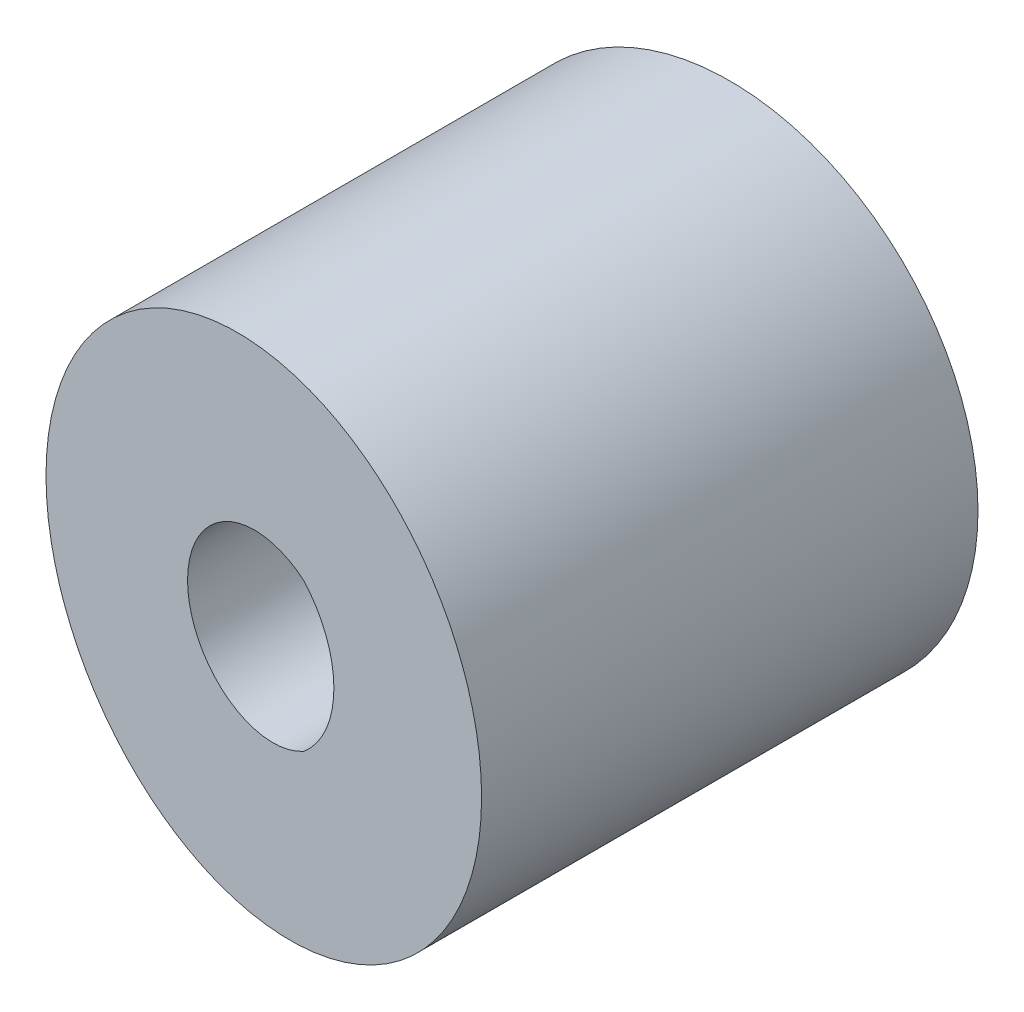
ISO-10303-21;
HEADER;
FILE_DESCRIPTION(('STEP AP214'),'2;1');
FILE_NAME('part.step','',(''),(''),'','','');
FILE_SCHEMA(('AUTOMOTIVE_DESIGN { 1 0 10303 214 1 1 1 1 }'));
ENDSEC;
DATA;
#1=APPLICATION_CONTEXT('core data for automotive mechanical design processes');
#2=APPLICATION_PROTOCOL_DEFINITION('international standard','automotive_design',2000,#1);
#3=PRODUCT_CONTEXT('',#1,'mechanical');
#4=PRODUCT('Part','Part','',(#3));
#5=PRODUCT_RELATED_PRODUCT_CATEGORY('part','',(#4));
#6=PRODUCT_DEFINITION_FORMATION('','',#4);
#7=PRODUCT_DEFINITION_CONTEXT('part definition',#1,'design');
#8=PRODUCT_DEFINITION('design','',#6,#7);
#9=PRODUCT_DEFINITION_SHAPE('','',#8);
#10=(LENGTH_UNIT() NAMED_UNIT(*) SI_UNIT(.MILLI.,.METRE.));
#11=(NAMED_UNIT(*) PLANE_ANGLE_UNIT() SI_UNIT($,.RADIAN.));
#12=(NAMED_UNIT(*) SI_UNIT($,.STERADIAN.) SOLID_ANGLE_UNIT());
#13=UNCERTAINTY_MEASURE_WITH_UNIT(LENGTH_MEASURE(1.E-05),#10,'distance_accuracy_value','');
#14=(GEOMETRIC_REPRESENTATION_CONTEXT(3) GLOBAL_UNCERTAINTY_ASSIGNED_CONTEXT((#13)) GLOBAL_UNIT_ASSIGNED_CONTEXT((#10,
#11,#12)) REPRESENTATION_CONTEXT('',''));
#15=CARTESIAN_POINT('',(0.,0.,0.));
#16=DIRECTION('',(0.,0.,1.));
#17=DIRECTION('',(1.,0.,0.));
#18=AXIS2_PLACEMENT_3D('',#15,#16,#17);
#19=CARTESIAN_POINT('',(0.,0.,20.));
#20=DIRECTION('',(0.,0.,-1.));
#21=DIRECTION('',(-1.,0.,0.));
#22=AXIS2_PLACEMENT_3D('',#19,#20,#21);
#23=CYLINDRICAL_SURFACE('',#22,10.);
#24=CARTESIAN_POINT('',(0.,0.,18.775));
#25=DIRECTION('',(0.121591084055229,0.,-0.992580278001872));
#26=DIRECTION('',(-0.992580278001872,0.,-0.121591084055229));
#27=AXIS2_PLACEMENT_3D('',#24,#25,#26);
#28=ELLIPSE('',#27,10.0747518579864,10.);
#29=CARTESIAN_POINT('',(-10.,0.,17.55));
#30=VERTEX_POINT('',#29);
#31=EDGE_CURVE('E58',#30,#30,#28,.T.);
#32=ORIENTED_EDGE('',*,*,#31,.T.);
#33=EDGE_LOOP('',(#32));
#34=FACE_BOUND('',#33,.T.);
#35=CARTESIAN_POINT('',(0.,0.,0.));
#36=DIRECTION('',(0.,0.,1.));
#37=DIRECTION('',(1.,0.,0.));
#38=AXIS2_PLACEMENT_3D('',#35,#36,#37);
#39=CIRCLE('',#38,10.);
#40=CARTESIAN_POINT('',(10.,0.,0.));
#41=VERTEX_POINT('',#40);
#42=EDGE_CURVE('E55',#41,#41,#39,.T.);
#43=ORIENTED_EDGE('',*,*,#42,.T.);
#44=EDGE_LOOP('',(#43));
#45=FACE_BOUND('',#44,.T.);
#46=ADVANCED_FACE('F37',(#34,#45),#23,.T.);
#47=CARTESIAN_POINT('',(0.,0.,0.));
#48=DIRECTION('',(0.,0.,1.));
#49=DIRECTION('',(1.,0.,0.));
#50=AXIS2_PLACEMENT_3D('',#47,#48,#49);
#51=PLANE('',#50);
#52=CARTESIAN_POINT('',(0.,0.,0.));
#53=DIRECTION('',(0.,0.,-1.));
#54=DIRECTION('',(-1.,0.,0.));
#55=AXIS2_PLACEMENT_3D('',#52,#53,#54);
#56=CIRCLE('',#55,3.49999999999999);
#57=CARTESIAN_POINT('',(-3.49999999999999,0.,0.));
#58=VERTEX_POINT('',#57);
#59=EDGE_CURVE('E59',#58,#58,#56,.T.);
#60=ORIENTED_EDGE('',*,*,#59,.F.);
#61=EDGE_LOOP('',(#60));
#62=FACE_BOUND('',#61,.T.);
#63=ORIENTED_EDGE('',*,*,#42,.F.);
#64=EDGE_LOOP('',(#63));
#65=FACE_BOUND('',#64,.T.);
#66=ADVANCED_FACE('F64',(#62,#65),#51,.F.);
#67=CARTESIAN_POINT('',(-175.19041906733,-103.,-2.68582633574798));
#68=DIRECTION('',(0.121591084055229,0.,-0.992580278001872));
#69=DIRECTION('',(-0.992580278001872,0.,-0.121591084055229));
#70=AXIS2_PLACEMENT_3D('',#67,#68,#69);
#71=PLANE('',#70);
#72=CARTESIAN_POINT('',(-0.824159091540292,0.,18.6740405112863));
#73=DIRECTION('',(0.121591084055229,0.,-0.992580278001872));
#74=DIRECTION('',(-0.992580278001872,0.,-0.121591084055229));
#75=AXIS2_PLACEMENT_3D('',#72,#73,#74);
#76=ELLIPSE('',#75,4.07270603570868,3.95758367046223);
#77=CARTESIAN_POINT('',(1.83673469387751,2.97932973406882,19.));
#78=VERTEX_POINT('',#77);
#79=CARTESIAN_POINT('',(1.83673469387751,-2.97932973406882,19.));
#80=VERTEX_POINT('',#79);
#81=EDGE_CURVE('E44',#78,#80,#76,.T.);
#82=ORIENTED_EDGE('',*,*,#81,.T.);
#83=CARTESIAN_POINT('',(0.,0.,18.775));
#84=DIRECTION('',(0.121591084055229,0.,-0.992580278001872));
#85=DIRECTION('',(-0.992580278001872,0.,-0.121591084055229));
#86=AXIS2_PLACEMENT_3D('',#83,#84,#85);
#87=ELLIPSE('',#86,3.52616315029522,3.49999999999999);
#88=EDGE_CURVE('E11',#80,#78,#87,.T.);
#89=ORIENTED_EDGE('',*,*,#88,.T.);
#90=EDGE_LOOP('',(#82,#89));
#91=FACE_BOUND('',#90,.T.);
#92=ORIENTED_EDGE('',*,*,#31,.F.);
#93=EDGE_LOOP('',(#92));
#94=FACE_BOUND('',#93,.T.);
#95=ADVANCED_FACE('F61',(#91,#94),#71,.F.);
#96=CARTESIAN_POINT('',(0.,0.,0.));
#97=DIRECTION('',(0.,0.,-1.));
#98=DIRECTION('',(-1.,0.,0.));
#99=AXIS2_PLACEMENT_3D('',#96,#97,#98);
#100=CYLINDRICAL_SURFACE('',#99,3.49999999999999);
#101=ORIENTED_EDGE('',*,*,#59,.T.);
#102=EDGE_LOOP('',(#101));
#103=FACE_BOUND('',#102,.T.);
#104=CARTESIAN_POINT('',(0.,0.,19.));
#105=DIRECTION('',(0.,0.,-1.));
#106=DIRECTION('',(-1.,0.,0.));
#107=AXIS2_PLACEMENT_3D('',#104,#105,#106);
#108=CIRCLE('',#107,3.49999999999999);
#109=EDGE_CURVE('E50',#78,#80,#108,.T.);
#110=ORIENTED_EDGE('',*,*,#109,.F.);
#111=ORIENTED_EDGE('',*,*,#88,.F.);
#112=EDGE_LOOP('',(#110,#111));
#113=FACE_BOUND('',#112,.T.);
#114=ADVANCED_FACE('F57',(#103,#113),#100,.F.);
#115=CARTESIAN_POINT('',(0.,0.,19.));
#116=DIRECTION('',(0.,0.,-1.));
#117=DIRECTION('',(-1.,0.,0.));
#118=AXIS2_PLACEMENT_3D('',#115,#116,#117);
#119=CONICAL_SURFACE('',#118,3.49999999999999,1.02974425867665);
#120=ORIENTED_EDGE('',*,*,#109,.T.);
#121=ORIENTED_EDGE('',*,*,#81,.F.);
#122=EDGE_LOOP('',(#120,#121));
#123=FACE_BOUND('',#122,.T.);
#124=ADVANCED_FACE('F53',(#123),#119,.F.);
#125=CLOSED_SHELL('',(#46,#66,#95,#114,#124));
#126=MANIFOLD_SOLID_BREP('B2',#125);
#127=ADVANCED_BREP_SHAPE_REPRESENTATION('',(#18,#126),#14);
#128=SHAPE_DEFINITION_REPRESENTATION(#9,#127);
ENDSEC;
END-ISO-10303-21;
